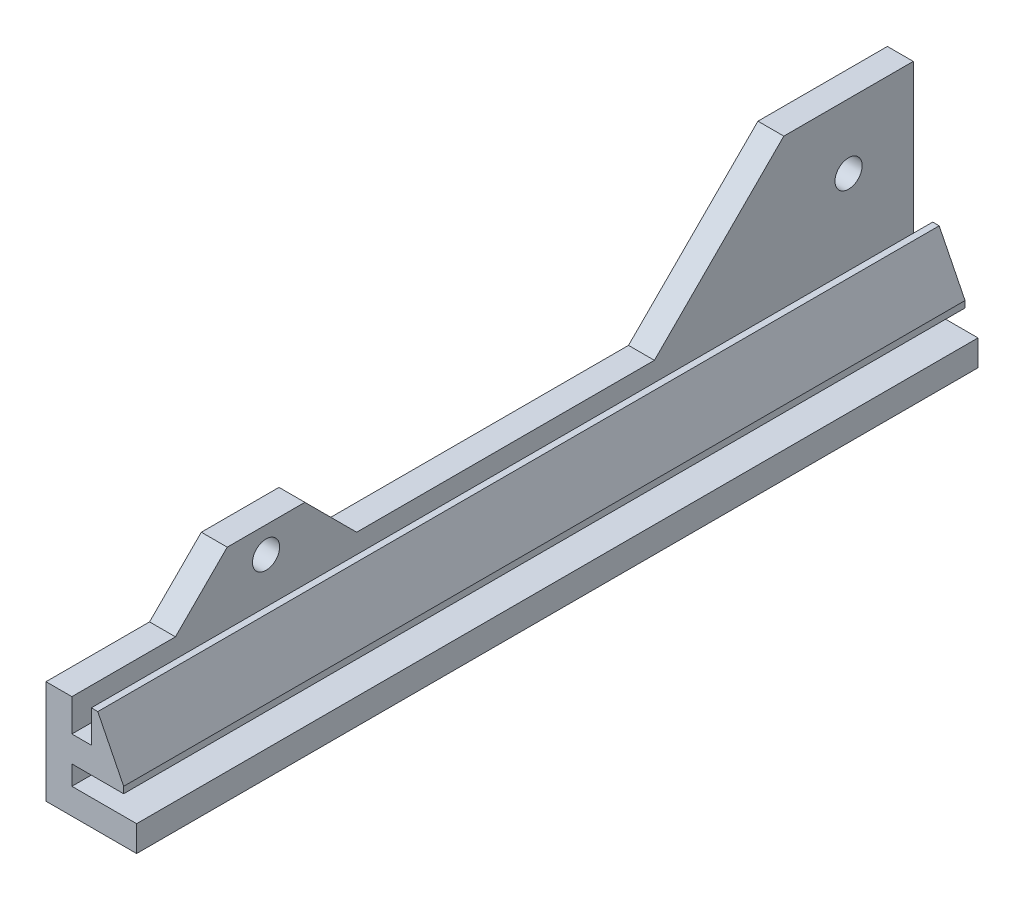
ISO-10303-21;
HEADER;
FILE_DESCRIPTION(('STEP AP214'),'2;1');
FILE_NAME('part.step','',(''),(''),'','','');
FILE_SCHEMA(('AUTOMOTIVE_DESIGN { 1 0 10303 214 1 1 1 1 }'));
ENDSEC;
DATA;
#1=APPLICATION_CONTEXT('core data for automotive mechanical design processes');
#2=APPLICATION_PROTOCOL_DEFINITION('international standard','automotive_design',2000,#1);
#3=PRODUCT_CONTEXT('',#1,'mechanical');
#4=PRODUCT('Part','Part','',(#3));
#5=PRODUCT_RELATED_PRODUCT_CATEGORY('part','',(#4));
#6=PRODUCT_DEFINITION_FORMATION('','',#4);
#7=PRODUCT_DEFINITION_CONTEXT('part definition',#1,'design');
#8=PRODUCT_DEFINITION('design','',#6,#7);
#9=PRODUCT_DEFINITION_SHAPE('','',#8);
#10=(LENGTH_UNIT() NAMED_UNIT(*) SI_UNIT(.MILLI.,.METRE.));
#11=(NAMED_UNIT(*) PLANE_ANGLE_UNIT() SI_UNIT($,.RADIAN.));
#12=(NAMED_UNIT(*) SI_UNIT($,.STERADIAN.) SOLID_ANGLE_UNIT());
#13=UNCERTAINTY_MEASURE_WITH_UNIT(LENGTH_MEASURE(1.E-05),#10,'distance_accuracy_value','');
#14=(GEOMETRIC_REPRESENTATION_CONTEXT(3) GLOBAL_UNCERTAINTY_ASSIGNED_CONTEXT((#13)) GLOBAL_UNIT_ASSIGNED_CONTEXT((#10,
#11,#12)) REPRESENTATION_CONTEXT('',''));
#15=CARTESIAN_POINT('',(0.,0.,0.));
#16=DIRECTION('',(0.,0.,1.));
#17=DIRECTION('',(1.,0.,0.));
#18=AXIS2_PLACEMENT_3D('',#15,#16,#17);
#19=CARTESIAN_POINT('',(0.,16.,130.));
#20=DIRECTION('',(0.,-1.,0.));
#21=DIRECTION('',(0.,0.,-1.));
#22=AXIS2_PLACEMENT_3D('',#19,#20,#21);
#23=PLANE('',#22);
#24=DIRECTION('',(0.,0.,-1.));
#25=VECTOR('',#24,1.);
#26=CARTESIAN_POINT('',(0.,16.,130.));
#27=LINE('',#26,#25);
#28=CARTESIAN_POINT('',(0.,16.,86.0000000000001));
#29=VERTEX_POINT('',#28);
#30=CARTESIAN_POINT('',(0.,16.,40.0000000000005));
#31=VERTEX_POINT('',#30);
#32=EDGE_CURVE('E297',#29,#31,#27,.T.);
#33=ORIENTED_EDGE('',*,*,#32,.F.);
#34=DIRECTION('',(1.,0.,0.));
#35=VECTOR('',#34,1.);
#36=CARTESIAN_POINT('',(0.,16.,86.0000000000001));
#37=LINE('',#36,#35);
#38=CARTESIAN_POINT('',(4.,16.,86.0000000000001));
#39=VERTEX_POINT('',#38);
#40=EDGE_CURVE('E185',#29,#39,#37,.T.);
#41=ORIENTED_EDGE('',*,*,#40,.T.);
#42=DIRECTION('',(0.,0.,-1.));
#43=VECTOR('',#42,1.);
#44=CARTESIAN_POINT('',(4.,16.,130.));
#45=LINE('',#44,#43);
#46=CARTESIAN_POINT('',(4.,16.,40.0000000000005));
#47=VERTEX_POINT('',#46);
#48=EDGE_CURVE('E335',#39,#47,#45,.T.);
#49=ORIENTED_EDGE('',*,*,#48,.T.);
#50=DIRECTION('',(-1.,0.,0.));
#51=VECTOR('',#50,1.);
#52=CARTESIAN_POINT('',(4.,16.,40.0000000000005));
#53=LINE('',#52,#51);
#54=EDGE_CURVE('E238',#47,#31,#53,.T.);
#55=ORIENTED_EDGE('',*,*,#54,.T.);
#56=EDGE_LOOP('',(#33,#41,#49,#55));
#57=FACE_BOUND('',#56,.T.);
#58=ADVANCED_FACE('F47',(#57),#23,.F.);
#59=CARTESIAN_POINT('',(0.,0.,130.));
#60=DIRECTION('',(1.,0.,0.));
#61=DIRECTION('',(0.,0.,-1.));
#62=AXIS2_PLACEMENT_3D('',#59,#60,#61);
#63=PLANE('',#62);
#64=DIRECTION('',(0.,-1.,0.));
#65=VECTOR('',#64,1.);
#66=CARTESIAN_POINT('',(0.,0.,0.));
#67=LINE('',#66,#65);
#68=CARTESIAN_POINT('',(0.,36.,0.));
#69=VERTEX_POINT('',#68);
#70=CARTESIAN_POINT('',(0.,0.,0.));
#71=VERTEX_POINT('',#70);
#72=EDGE_CURVE('E249',#69,#71,#67,.T.);
#73=ORIENTED_EDGE('',*,*,#72,.T.);
#74=DIRECTION('',(0.,0.,-1.));
#75=VECTOR('',#74,1.);
#76=CARTESIAN_POINT('',(0.,0.,130.));
#77=LINE('',#76,#75);
#78=CARTESIAN_POINT('',(0.,0.,130.));
#79=VERTEX_POINT('',#78);
#80=EDGE_CURVE('E379',#79,#71,#77,.T.);
#81=ORIENTED_EDGE('',*,*,#80,.F.);
#82=DIRECTION('',(0.,-1.,0.));
#83=VECTOR('',#82,1.);
#84=CARTESIAN_POINT('',(0.,0.,130.));
#85=LINE('',#84,#83);
#86=CARTESIAN_POINT('',(0.,16.,130.));
#87=VERTEX_POINT('',#86);
#88=EDGE_CURVE('E256',#87,#79,#85,.T.);
#89=ORIENTED_EDGE('',*,*,#88,.F.);
#90=CARTESIAN_POINT('',(0.,16.,114.));
#91=VERTEX_POINT('',#90);
#92=EDGE_CURVE('E332',#87,#91,#27,.T.);
#93=ORIENTED_EDGE('',*,*,#92,.T.);
#94=DIRECTION('',(0.,0.707106781186543,-0.707106781186552));
#95=VECTOR('',#94,1.);
#96=CARTESIAN_POINT('',(0.,1.32476551201444E-13,130.));
#97=LINE('',#96,#95);
#98=CARTESIAN_POINT('',(0.,24.,106.));
#99=VERTEX_POINT('',#98);
#100=EDGE_CURVE('E57',#91,#99,#97,.T.);
#101=ORIENTED_EDGE('',*,*,#100,.T.);
#102=DIRECTION('',(0.,0.,-1.));
#103=VECTOR('',#102,1.);
#104=CARTESIAN_POINT('',(0.,24.,106.));
#105=LINE('',#104,#103);
#106=CARTESIAN_POINT('',(0.,24.,94.));
#107=VERTEX_POINT('',#106);
#108=EDGE_CURVE('E197',#99,#107,#105,.T.);
#109=ORIENTED_EDGE('',*,*,#108,.T.);
#110=DIRECTION('',(0.,-0.707106781186551,-0.707106781186544));
#111=VECTOR('',#110,1.);
#112=CARTESIAN_POINT('',(0.,29.9999999999999,99.9999999999998));
#113=LINE('',#112,#111);
#114=EDGE_CURVE('E180',#107,#29,#113,.T.);
#115=ORIENTED_EDGE('',*,*,#114,.T.);
#116=ORIENTED_EDGE('',*,*,#32,.T.);
#117=DIRECTION('',(0.,0.707106781186539,-0.707106781186556));
#118=VECTOR('',#117,1.);
#119=CARTESIAN_POINT('',(0.,36.,20.));
#120=LINE('',#119,#118);
#121=CARTESIAN_POINT('',(0.,36.,20.));
#122=VERTEX_POINT('',#121);
#123=EDGE_CURVE('E225',#31,#122,#120,.T.);
#124=ORIENTED_EDGE('',*,*,#123,.T.);
#125=DIRECTION('',(0.,0.,-1.));
#126=VECTOR('',#125,1.);
#127=CARTESIAN_POINT('',(0.,36.,0.));
#128=LINE('',#127,#126);
#129=EDGE_CURVE('E234',#122,#69,#128,.T.);
#130=ORIENTED_EDGE('',*,*,#129,.T.);
#131=EDGE_LOOP('',(#73,#81,#89,#93,#101,#109,#115,#116,#124,#130));
#132=FACE_BOUND('',#131,.T.);
#133=CARTESIAN_POINT('',(0.,26.,10.));
#134=DIRECTION('',(-1.,0.,0.));
#135=DIRECTION('',(0.,0.,1.));
#136=AXIS2_PLACEMENT_3D('',#133,#134,#135);
#137=CIRCLE('',#136,2.1);
#138=CARTESIAN_POINT('',(0.,26.,12.1));
#139=VERTEX_POINT('',#138);
#140=EDGE_CURVE('E219',#139,#139,#137,.T.);
#141=ORIENTED_EDGE('',*,*,#140,.F.);
#142=EDGE_LOOP('',(#141));
#143=FACE_BOUND('',#142,.T.);
#144=CARTESIAN_POINT('',(0.,20.,100.));
#145=DIRECTION('',(-1.,0.,0.));
#146=DIRECTION('',(0.,0.,1.));
#147=AXIS2_PLACEMENT_3D('',#144,#145,#146);
#148=CIRCLE('',#147,2.1);
#149=CARTESIAN_POINT('',(0.,20.,102.1));
#150=VERTEX_POINT('',#149);
#151=EDGE_CURVE('E212',#150,#150,#148,.T.);
#152=ORIENTED_EDGE('',*,*,#151,.F.);
#153=EDGE_LOOP('',(#152));
#154=FACE_BOUND('',#153,.T.);
#155=ADVANCED_FACE('F203',(#132,#143,#154),#63,.F.);
#156=CARTESIAN_POINT('',(0.,0.,130.));
#157=DIRECTION('',(0.,1.,0.));
#158=DIRECTION('',(0.,0.,1.));
#159=AXIS2_PLACEMENT_3D('',#156,#157,#158);
#160=PLANE('',#159);
#161=DIRECTION('',(1.,0.,0.));
#162=VECTOR('',#161,1.);
#163=CARTESIAN_POINT('',(0.,0.,0.));
#164=LINE('',#163,#162);
#165=CARTESIAN_POINT('',(14.,0.,0.));
#166=VERTEX_POINT('',#165);
#167=EDGE_CURVE('E300',#71,#166,#164,.T.);
#168=ORIENTED_EDGE('',*,*,#167,.T.);
#169=DIRECTION('',(0.,0.,-1.));
#170=VECTOR('',#169,1.);
#171=CARTESIAN_POINT('',(14.,0.,130.));
#172=LINE('',#171,#170);
#173=CARTESIAN_POINT('',(14.,0.,130.));
#174=VERTEX_POINT('',#173);
#175=EDGE_CURVE('E375',#174,#166,#172,.T.);
#176=ORIENTED_EDGE('',*,*,#175,.F.);
#177=DIRECTION('',(1.,0.,0.));
#178=VECTOR('',#177,1.);
#179=CARTESIAN_POINT('',(0.,0.,130.));
#180=LINE('',#179,#178);
#181=EDGE_CURVE('E260',#79,#174,#180,.T.);
#182=ORIENTED_EDGE('',*,*,#181,.F.);
#183=ORIENTED_EDGE('',*,*,#80,.T.);
#184=EDGE_LOOP('',(#168,#176,#182,#183));
#185=FACE_BOUND('',#184,.T.);
#186=ADVANCED_FACE('F412',(#185),#160,.F.);
#187=CARTESIAN_POINT('',(14.,0.,130.));
#188=DIRECTION('',(-1.,0.,0.));
#189=DIRECTION('',(0.,0.,1.));
#190=AXIS2_PLACEMENT_3D('',#187,#188,#189);
#191=PLANE('',#190);
#192=DIRECTION('',(0.,1.,0.));
#193=VECTOR('',#192,1.);
#194=CARTESIAN_POINT('',(14.,0.,0.));
#195=LINE('',#194,#193);
#196=CARTESIAN_POINT('',(14.,4.,0.));
#197=VERTEX_POINT('',#196);
#198=EDGE_CURVE('E303',#166,#197,#195,.T.);
#199=ORIENTED_EDGE('',*,*,#198,.T.);
#200=DIRECTION('',(0.,0.,-1.));
#201=VECTOR('',#200,1.);
#202=CARTESIAN_POINT('',(14.,4.,130.));
#203=LINE('',#202,#201);
#204=CARTESIAN_POINT('',(14.,4.,130.));
#205=VERTEX_POINT('',#204);
#206=EDGE_CURVE('E371',#205,#197,#203,.T.);
#207=ORIENTED_EDGE('',*,*,#206,.F.);
#208=DIRECTION('',(0.,1.,0.));
#209=VECTOR('',#208,1.);
#210=CARTESIAN_POINT('',(14.,0.,130.));
#211=LINE('',#210,#209);
#212=EDGE_CURVE('E264',#174,#205,#211,.T.);
#213=ORIENTED_EDGE('',*,*,#212,.F.);
#214=ORIENTED_EDGE('',*,*,#175,.T.);
#215=EDGE_LOOP('',(#199,#207,#213,#214));
#216=FACE_BOUND('',#215,.T.);
#217=ADVANCED_FACE('F465',(#216),#191,.F.);
#218=CARTESIAN_POINT('',(14.,4.,130.));
#219=DIRECTION('',(0.,-1.,0.));
#220=DIRECTION('',(1.,0.,0.));
#221=AXIS2_PLACEMENT_3D('',#218,#219,#220);
#222=PLANE('',#221);
#223=DIRECTION('',(-1.,0.,0.));
#224=VECTOR('',#223,1.);
#225=CARTESIAN_POINT('',(14.,4.,0.));
#226=LINE('',#225,#224);
#227=CARTESIAN_POINT('',(4.,4.,0.));
#228=VERTEX_POINT('',#227);
#229=EDGE_CURVE('E306',#197,#228,#226,.T.);
#230=ORIENTED_EDGE('',*,*,#229,.T.);
#231=DIRECTION('',(0.,0.,-1.));
#232=VECTOR('',#231,1.);
#233=CARTESIAN_POINT('',(4.,4.,130.));
#234=LINE('',#233,#232);
#235=CARTESIAN_POINT('',(4.,4.,130.));
#236=VERTEX_POINT('',#235);
#237=EDGE_CURVE('E367',#236,#228,#234,.T.);
#238=ORIENTED_EDGE('',*,*,#237,.F.);
#239=DIRECTION('',(-1.,0.,0.));
#240=VECTOR('',#239,1.);
#241=CARTESIAN_POINT('',(14.,4.,130.));
#242=LINE('',#241,#240);
#243=EDGE_CURVE('E267',#205,#236,#242,.T.);
#244=ORIENTED_EDGE('',*,*,#243,.F.);
#245=ORIENTED_EDGE('',*,*,#206,.T.);
#246=EDGE_LOOP('',(#230,#238,#244,#245));
#247=FACE_BOUND('',#246,.T.);
#248=ADVANCED_FACE('F462',(#247),#222,.F.);
#249=CARTESIAN_POINT('',(4.,4.,130.));
#250=DIRECTION('',(-1.,0.,0.));
#251=DIRECTION('',(0.,0.,1.));
#252=AXIS2_PLACEMENT_3D('',#249,#250,#251);
#253=PLANE('',#252);
#254=DIRECTION('',(0.,1.,0.));
#255=VECTOR('',#254,1.);
#256=CARTESIAN_POINT('',(4.,4.,0.));
#257=LINE('',#256,#255);
#258=CARTESIAN_POINT('',(4.,7.,0.));
#259=VERTEX_POINT('',#258);
#260=EDGE_CURVE('E309',#228,#259,#257,.T.);
#261=ORIENTED_EDGE('',*,*,#260,.T.);
#262=DIRECTION('',(0.,0.,-1.));
#263=VECTOR('',#262,1.);
#264=CARTESIAN_POINT('',(4.,7.,130.));
#265=LINE('',#264,#263);
#266=CARTESIAN_POINT('',(4.,7.,130.));
#267=VERTEX_POINT('',#266);
#268=EDGE_CURVE('E363',#267,#259,#265,.T.);
#269=ORIENTED_EDGE('',*,*,#268,.F.);
#270=DIRECTION('',(0.,1.,0.));
#271=VECTOR('',#270,1.);
#272=CARTESIAN_POINT('',(4.,4.,130.));
#273=LINE('',#272,#271);
#274=EDGE_CURVE('E270',#236,#267,#273,.T.);
#275=ORIENTED_EDGE('',*,*,#274,.F.);
#276=ORIENTED_EDGE('',*,*,#237,.T.);
#277=EDGE_LOOP('',(#261,#269,#275,#276));
#278=FACE_BOUND('',#277,.T.);
#279=ADVANCED_FACE('F457',(#278),#253,.F.);
#280=CARTESIAN_POINT('',(4.,7.,130.));
#281=DIRECTION('',(0.,1.,0.));
#282=DIRECTION('',(0.,0.,1.));
#283=AXIS2_PLACEMENT_3D('',#280,#281,#282);
#284=PLANE('',#283);
#285=DIRECTION('',(1.,0.,0.));
#286=VECTOR('',#285,1.);
#287=CARTESIAN_POINT('',(4.,7.,0.));
#288=LINE('',#287,#286);
#289=CARTESIAN_POINT('',(12.,7.,0.));
#290=VERTEX_POINT('',#289);
#291=EDGE_CURVE('E312',#259,#290,#288,.T.);
#292=ORIENTED_EDGE('',*,*,#291,.T.);
#293=DIRECTION('',(0.,0.,-1.));
#294=VECTOR('',#293,1.);
#295=CARTESIAN_POINT('',(12.,7.,130.));
#296=LINE('',#295,#294);
#297=CARTESIAN_POINT('',(12.,7.,130.));
#298=VERTEX_POINT('',#297);
#299=EDGE_CURVE('E359',#298,#290,#296,.T.);
#300=ORIENTED_EDGE('',*,*,#299,.F.);
#301=DIRECTION('',(1.,0.,0.));
#302=VECTOR('',#301,1.);
#303=CARTESIAN_POINT('',(4.,7.,130.));
#304=LINE('',#303,#302);
#305=EDGE_CURVE('E273',#267,#298,#304,.T.);
#306=ORIENTED_EDGE('',*,*,#305,.F.);
#307=ORIENTED_EDGE('',*,*,#268,.T.);
#308=EDGE_LOOP('',(#292,#300,#306,#307));
#309=FACE_BOUND('',#308,.T.);
#310=ADVANCED_FACE('F453',(#309),#284,.F.);
#311=CARTESIAN_POINT('',(12.,8.,130.));
#312=DIRECTION('',(-1.,0.,0.));
#313=DIRECTION('',(0.,0.,1.));
#314=AXIS2_PLACEMENT_3D('',#311,#312,#313);
#315=PLANE('',#314);
#316=DIRECTION('',(0.,1.,0.));
#317=VECTOR('',#316,1.);
#318=CARTESIAN_POINT('',(12.,8.,0.));
#319=LINE('',#318,#317);
#320=CARTESIAN_POINT('',(12.,8.,0.));
#321=VERTEX_POINT('',#320);
#322=EDGE_CURVE('E315',#290,#321,#319,.T.);
#323=ORIENTED_EDGE('',*,*,#322,.T.);
#324=DIRECTION('',(0.,0.,-1.));
#325=VECTOR('',#324,1.);
#326=CARTESIAN_POINT('',(12.,8.,130.));
#327=LINE('',#326,#325);
#328=CARTESIAN_POINT('',(12.,8.,130.));
#329=VERTEX_POINT('',#328);
#330=EDGE_CURVE('E355',#329,#321,#327,.T.);
#331=ORIENTED_EDGE('',*,*,#330,.F.);
#332=DIRECTION('',(0.,1.,0.));
#333=VECTOR('',#332,1.);
#334=CARTESIAN_POINT('',(12.,8.,130.));
#335=LINE('',#334,#333);
#336=EDGE_CURVE('E276',#298,#329,#335,.T.);
#337=ORIENTED_EDGE('',*,*,#336,.F.);
#338=ORIENTED_EDGE('',*,*,#299,.T.);
#339=EDGE_LOOP('',(#323,#331,#337,#338));
#340=FACE_BOUND('',#339,.T.);
#341=ADVANCED_FACE('F449',(#340),#315,.F.);
#342=CARTESIAN_POINT('',(8.,16.,130.));
#343=DIRECTION('',(-0.894427190999916,-0.447213595499958,0.));
#344=DIRECTION('',(0.447213595499958,-0.894427190999916,0.));
#345=AXIS2_PLACEMENT_3D('',#342,#343,#344);
#346=PLANE('',#345);
#347=DIRECTION('',(-0.447213595499958,0.894427190999916,0.));
#348=VECTOR('',#347,1.);
#349=CARTESIAN_POINT('',(8.,16.,0.));
#350=LINE('',#349,#348);
#351=CARTESIAN_POINT('',(8.,16.,0.));
#352=VERTEX_POINT('',#351);
#353=EDGE_CURVE('E318',#321,#352,#350,.T.);
#354=ORIENTED_EDGE('',*,*,#353,.T.);
#355=DIRECTION('',(0.,0.,-1.));
#356=VECTOR('',#355,1.);
#357=CARTESIAN_POINT('',(8.,16.,130.));
#358=LINE('',#357,#356);
#359=CARTESIAN_POINT('',(8.,16.,130.));
#360=VERTEX_POINT('',#359);
#361=EDGE_CURVE('E351',#360,#352,#358,.T.);
#362=ORIENTED_EDGE('',*,*,#361,.F.);
#363=DIRECTION('',(-0.447213595499958,0.894427190999916,0.));
#364=VECTOR('',#363,1.);
#365=CARTESIAN_POINT('',(8.,16.,130.));
#366=LINE('',#365,#364);
#367=EDGE_CURVE('E279',#329,#360,#366,.T.);
#368=ORIENTED_EDGE('',*,*,#367,.F.);
#369=ORIENTED_EDGE('',*,*,#330,.T.);
#370=EDGE_LOOP('',(#354,#362,#368,#369));
#371=FACE_BOUND('',#370,.T.);
#372=ADVANCED_FACE('F444',(#371),#346,.F.);
#373=CARTESIAN_POINT('',(7.,16.,130.));
#374=DIRECTION('',(0.,-1.,0.));
#375=DIRECTION('',(0.,0.,-1.));
#376=AXIS2_PLACEMENT_3D('',#373,#374,#375);
#377=PLANE('',#376);
#378=DIRECTION('',(-1.,0.,0.));
#379=VECTOR('',#378,1.);
#380=CARTESIAN_POINT('',(7.,16.,0.));
#381=LINE('',#380,#379);
#382=CARTESIAN_POINT('',(7.,16.,0.));
#383=VERTEX_POINT('',#382);
#384=EDGE_CURVE('E321',#352,#383,#381,.T.);
#385=ORIENTED_EDGE('',*,*,#384,.T.);
#386=DIRECTION('',(0.,0.,-1.));
#387=VECTOR('',#386,1.);
#388=CARTESIAN_POINT('',(7.,16.,130.));
#389=LINE('',#388,#387);
#390=CARTESIAN_POINT('',(7.,16.,130.));
#391=VERTEX_POINT('',#390);
#392=EDGE_CURVE('E347',#391,#383,#389,.T.);
#393=ORIENTED_EDGE('',*,*,#392,.F.);
#394=DIRECTION('',(-1.,0.,0.));
#395=VECTOR('',#394,1.);
#396=CARTESIAN_POINT('',(7.,16.,130.));
#397=LINE('',#396,#395);
#398=EDGE_CURVE('E282',#360,#391,#397,.T.);
#399=ORIENTED_EDGE('',*,*,#398,.F.);
#400=ORIENTED_EDGE('',*,*,#361,.T.);
#401=EDGE_LOOP('',(#385,#393,#399,#400));
#402=FACE_BOUND('',#401,.T.);
#403=ADVANCED_FACE('F438',(#402),#377,.F.);
#404=CARTESIAN_POINT('',(7.,11.,130.));
#405=DIRECTION('',(1.,0.,0.));
#406=DIRECTION('',(0.,0.,-1.));
#407=AXIS2_PLACEMENT_3D('',#404,#405,#406);
#408=PLANE('',#407);
#409=DIRECTION('',(0.,-1.,0.));
#410=VECTOR('',#409,1.);
#411=CARTESIAN_POINT('',(7.,11.,0.));
#412=LINE('',#411,#410);
#413=CARTESIAN_POINT('',(7.,11.,0.));
#414=VERTEX_POINT('',#413);
#415=EDGE_CURVE('E324',#383,#414,#412,.T.);
#416=ORIENTED_EDGE('',*,*,#415,.T.);
#417=DIRECTION('',(0.,0.,-1.));
#418=VECTOR('',#417,1.);
#419=CARTESIAN_POINT('',(7.,11.,130.));
#420=LINE('',#419,#418);
#421=CARTESIAN_POINT('',(7.,11.,130.));
#422=VERTEX_POINT('',#421);
#423=EDGE_CURVE('E343',#422,#414,#420,.T.);
#424=ORIENTED_EDGE('',*,*,#423,.F.);
#425=DIRECTION('',(0.,-1.,0.));
#426=VECTOR('',#425,1.);
#427=CARTESIAN_POINT('',(7.,11.,130.));
#428=LINE('',#427,#426);
#429=EDGE_CURVE('E285',#391,#422,#428,.T.);
#430=ORIENTED_EDGE('',*,*,#429,.F.);
#431=ORIENTED_EDGE('',*,*,#392,.T.);
#432=EDGE_LOOP('',(#416,#424,#430,#431));
#433=FACE_BOUND('',#432,.T.);
#434=ADVANCED_FACE('F434',(#433),#408,.F.);
#435=CARTESIAN_POINT('',(4.,11.,130.));
#436=DIRECTION('',(0.,-1.,0.));
#437=DIRECTION('',(0.,0.,-1.));
#438=AXIS2_PLACEMENT_3D('',#435,#436,#437);
#439=PLANE('',#438);
#440=DIRECTION('',(-1.,0.,0.));
#441=VECTOR('',#440,1.);
#442=CARTESIAN_POINT('',(4.,11.,0.));
#443=LINE('',#442,#441);
#444=CARTESIAN_POINT('',(4.,11.,0.));
#445=VERTEX_POINT('',#444);
#446=EDGE_CURVE('E327',#414,#445,#443,.T.);
#447=ORIENTED_EDGE('',*,*,#446,.T.);
#448=DIRECTION('',(0.,0.,-1.));
#449=VECTOR('',#448,1.);
#450=CARTESIAN_POINT('',(4.,11.,130.));
#451=LINE('',#450,#449);
#452=CARTESIAN_POINT('',(4.,11.,130.));
#453=VERTEX_POINT('',#452);
#454=EDGE_CURVE('E339',#453,#445,#451,.T.);
#455=ORIENTED_EDGE('',*,*,#454,.F.);
#456=DIRECTION('',(-1.,0.,0.));
#457=VECTOR('',#456,1.);
#458=CARTESIAN_POINT('',(4.,11.,130.));
#459=LINE('',#458,#457);
#460=EDGE_CURVE('E288',#422,#453,#459,.T.);
#461=ORIENTED_EDGE('',*,*,#460,.F.);
#462=ORIENTED_EDGE('',*,*,#423,.T.);
#463=EDGE_LOOP('',(#447,#455,#461,#462));
#464=FACE_BOUND('',#463,.T.);
#465=ADVANCED_FACE('F429',(#464),#439,.F.);
#466=CARTESIAN_POINT('',(4.,16.,130.));
#467=DIRECTION('',(-1.,0.,0.));
#468=DIRECTION('',(0.,-1.,0.));
#469=AXIS2_PLACEMENT_3D('',#466,#467,#468);
#470=PLANE('',#469);
#471=DIRECTION('',(0.,1.,0.));
#472=VECTOR('',#471,1.);
#473=CARTESIAN_POINT('',(4.,16.,0.));
#474=LINE('',#473,#472);
#475=CARTESIAN_POINT('',(4.,36.,0.));
#476=VERTEX_POINT('',#475);
#477=EDGE_CURVE('E261',#445,#476,#474,.T.);
#478=ORIENTED_EDGE('',*,*,#477,.T.);
#479=DIRECTION('',(0.,0.,-1.));
#480=VECTOR('',#479,1.);
#481=CARTESIAN_POINT('',(4.,36.,0.));
#482=LINE('',#481,#480);
#483=CARTESIAN_POINT('',(4.,36.,20.));
#484=VERTEX_POINT('',#483);
#485=EDGE_CURVE('E233',#484,#476,#482,.T.);
#486=ORIENTED_EDGE('',*,*,#485,.F.);
#487=DIRECTION('',(0.,0.707106781186539,-0.707106781186556));
#488=VECTOR('',#487,1.);
#489=CARTESIAN_POINT('',(4.,36.,20.));
#490=LINE('',#489,#488);
#491=EDGE_CURVE('E229',#47,#484,#490,.T.);
#492=ORIENTED_EDGE('',*,*,#491,.F.);
#493=ORIENTED_EDGE('',*,*,#48,.F.);
#494=DIRECTION('',(0.,0.707106781186551,0.707106781186544));
#495=VECTOR('',#494,1.);
#496=CARTESIAN_POINT('',(4.,38.,108.));
#497=LINE('',#496,#495);
#498=CARTESIAN_POINT('',(4.,24.,94.));
#499=VERTEX_POINT('',#498);
#500=EDGE_CURVE('E190',#39,#499,#497,.T.);
#501=ORIENTED_EDGE('',*,*,#500,.T.);
#502=DIRECTION('',(0.,0.,-1.));
#503=VECTOR('',#502,1.);
#504=CARTESIAN_POINT('',(4.,24.,106.));
#505=LINE('',#504,#503);
#506=CARTESIAN_POINT('',(4.,24.,106.));
#507=VERTEX_POINT('',#506);
#508=EDGE_CURVE('E198',#507,#499,#505,.T.);
#509=ORIENTED_EDGE('',*,*,#508,.F.);
#510=DIRECTION('',(0.,-0.707106781186543,0.707106781186552));
#511=VECTOR('',#510,1.);
#512=CARTESIAN_POINT('',(4.,8.00000000000004,122.));
#513=LINE('',#512,#511);
#514=CARTESIAN_POINT('',(4.,16.,114.));
#515=VERTEX_POINT('',#514);
#516=EDGE_CURVE('E11',#507,#515,#513,.T.);
#517=ORIENTED_EDGE('',*,*,#516,.T.);
#518=CARTESIAN_POINT('',(4.,16.,130.));
#519=VERTEX_POINT('',#518);
#520=EDGE_CURVE('E336',#519,#515,#45,.T.);
#521=ORIENTED_EDGE('',*,*,#520,.F.);
#522=DIRECTION('',(0.,1.,0.));
#523=VECTOR('',#522,1.);
#524=CARTESIAN_POINT('',(4.,16.,130.));
#525=LINE('',#524,#523);
#526=EDGE_CURVE('E291',#453,#519,#525,.T.);
#527=ORIENTED_EDGE('',*,*,#526,.F.);
#528=ORIENTED_EDGE('',*,*,#454,.T.);
#529=EDGE_LOOP('',(#478,#486,#492,#493,#501,#509,#517,#521,#527,#528));
#530=FACE_BOUND('',#529,.T.);
#531=CARTESIAN_POINT('',(4.,26.,10.));
#532=DIRECTION('',(-1.,0.,0.));
#533=DIRECTION('',(0.,0.,1.));
#534=AXIS2_PLACEMENT_3D('',#531,#532,#533);
#535=CIRCLE('',#534,2.1);
#536=CARTESIAN_POINT('',(4.,26.,12.1));
#537=VERTEX_POINT('',#536);
#538=EDGE_CURVE('E221',#537,#537,#535,.T.);
#539=ORIENTED_EDGE('',*,*,#538,.T.);
#540=EDGE_LOOP('',(#539));
#541=FACE_BOUND('',#540,.T.);
#542=CARTESIAN_POINT('',(4.,20.,100.));
#543=DIRECTION('',(-1.,0.,0.));
#544=DIRECTION('',(0.,0.,1.));
#545=AXIS2_PLACEMENT_3D('',#542,#543,#544);
#546=CIRCLE('',#545,2.1);
#547=CARTESIAN_POINT('',(4.,20.,102.1));
#548=VERTEX_POINT('',#547);
#549=EDGE_CURVE('E207',#548,#548,#546,.T.);
#550=ORIENTED_EDGE('',*,*,#549,.T.);
#551=EDGE_LOOP('',(#550));
#552=FACE_BOUND('',#551,.T.);
#553=ADVANCED_FACE('F421',(#530,#541,#552),#470,.F.);
#554=ORIENTED_EDGE('',*,*,#520,.T.);
#555=DIRECTION('',(-1.,0.,0.));
#556=VECTOR('',#555,1.);
#557=CARTESIAN_POINT('',(0.,16.,114.));
#558=LINE('',#557,#556);
#559=EDGE_CURVE('E191',#515,#91,#558,.T.);
#560=ORIENTED_EDGE('',*,*,#559,.T.);
#561=ORIENTED_EDGE('',*,*,#92,.F.);
#562=DIRECTION('',(-1.,0.,0.));
#563=VECTOR('',#562,1.);
#564=CARTESIAN_POINT('',(0.,16.,130.));
#565=LINE('',#564,#563);
#566=EDGE_CURVE('E294',#519,#87,#565,.T.);
#567=ORIENTED_EDGE('',*,*,#566,.F.);
#568=EDGE_LOOP('',(#554,#560,#561,#567));
#569=FACE_BOUND('',#568,.T.);
#570=ADVANCED_FACE('F419',(#569),#23,.F.);
#571=CARTESIAN_POINT('',(0.,0.,130.));
#572=DIRECTION('',(0.,0.,-1.));
#573=DIRECTION('',(-1.,0.,0.));
#574=AXIS2_PLACEMENT_3D('',#571,#572,#573);
#575=PLANE('',#574);
#576=ORIENTED_EDGE('',*,*,#88,.T.);
#577=ORIENTED_EDGE('',*,*,#181,.T.);
#578=ORIENTED_EDGE('',*,*,#212,.T.);
#579=ORIENTED_EDGE('',*,*,#243,.T.);
#580=ORIENTED_EDGE('',*,*,#274,.T.);
#581=ORIENTED_EDGE('',*,*,#305,.T.);
#582=ORIENTED_EDGE('',*,*,#336,.T.);
#583=ORIENTED_EDGE('',*,*,#367,.T.);
#584=ORIENTED_EDGE('',*,*,#398,.T.);
#585=ORIENTED_EDGE('',*,*,#429,.T.);
#586=ORIENTED_EDGE('',*,*,#460,.T.);
#587=ORIENTED_EDGE('',*,*,#526,.T.);
#588=ORIENTED_EDGE('',*,*,#566,.T.);
#589=EDGE_LOOP('',(#576,#577,#578,#579,#580,#581,#582,#583,#584,#585,#586,#587,#588));
#590=FACE_BOUND('',#589,.T.);
#591=ADVANCED_FACE('F415',(#590),#575,.F.);
#592=CARTESIAN_POINT('',(0.,0.,0.));
#593=DIRECTION('',(0.,0.,-1.));
#594=DIRECTION('',(-1.,0.,0.));
#595=AXIS2_PLACEMENT_3D('',#592,#593,#594);
#596=PLANE('',#595);
#597=ORIENTED_EDGE('',*,*,#72,.F.);
#598=DIRECTION('',(-1.,0.,0.));
#599=VECTOR('',#598,1.);
#600=CARTESIAN_POINT('',(4.,36.,0.));
#601=LINE('',#600,#599);
#602=EDGE_CURVE('E245',#476,#69,#601,.T.);
#603=ORIENTED_EDGE('',*,*,#602,.F.);
#604=ORIENTED_EDGE('',*,*,#477,.F.);
#605=ORIENTED_EDGE('',*,*,#446,.F.);
#606=ORIENTED_EDGE('',*,*,#415,.F.);
#607=ORIENTED_EDGE('',*,*,#384,.F.);
#608=ORIENTED_EDGE('',*,*,#353,.F.);
#609=ORIENTED_EDGE('',*,*,#322,.F.);
#610=ORIENTED_EDGE('',*,*,#291,.F.);
#611=ORIENTED_EDGE('',*,*,#260,.F.);
#612=ORIENTED_EDGE('',*,*,#229,.F.);
#613=ORIENTED_EDGE('',*,*,#198,.F.);
#614=ORIENTED_EDGE('',*,*,#167,.F.);
#615=EDGE_LOOP('',(#597,#603,#604,#605,#606,#607,#608,#609,#610,#611,#612,#613,#614));
#616=FACE_BOUND('',#615,.T.);
#617=ADVANCED_FACE('F406',(#616),#596,.T.);
#618=CARTESIAN_POINT('',(4.,36.,0.));
#619=DIRECTION('',(0.,1.,0.));
#620=DIRECTION('',(0.,0.,1.));
#621=AXIS2_PLACEMENT_3D('',#618,#619,#620);
#622=PLANE('',#621);
#623=ORIENTED_EDGE('',*,*,#129,.F.);
#624=DIRECTION('',(-1.,0.,0.));
#625=VECTOR('',#624,1.);
#626=CARTESIAN_POINT('',(4.,36.,20.));
#627=LINE('',#626,#625);
#628=EDGE_CURVE('E250',#484,#122,#627,.T.);
#629=ORIENTED_EDGE('',*,*,#628,.F.);
#630=ORIENTED_EDGE('',*,*,#485,.T.);
#631=ORIENTED_EDGE('',*,*,#602,.T.);
#632=EDGE_LOOP('',(#623,#629,#630,#631));
#633=FACE_BOUND('',#632,.T.);
#634=ADVANCED_FACE('F401',(#633),#622,.T.);
#635=CARTESIAN_POINT('',(4.,36.,20.));
#636=DIRECTION('',(0.,0.707106781186556,0.707106781186539));
#637=DIRECTION('',(0.,-0.707106781186539,0.707106781186556));
#638=AXIS2_PLACEMENT_3D('',#635,#636,#637);
#639=PLANE('',#638);
#640=ORIENTED_EDGE('',*,*,#123,.F.);
#641=ORIENTED_EDGE('',*,*,#54,.F.);
#642=ORIENTED_EDGE('',*,*,#491,.T.);
#643=ORIENTED_EDGE('',*,*,#628,.T.);
#644=EDGE_LOOP('',(#640,#641,#642,#643));
#645=FACE_BOUND('',#644,.T.);
#646=ADVANCED_FACE('F398',(#645),#639,.T.);
#647=CARTESIAN_POINT('',(4.,26.,10.));
#648=DIRECTION('',(-1.,0.,0.));
#649=DIRECTION('',(0.,0.,1.));
#650=AXIS2_PLACEMENT_3D('',#647,#648,#649);
#651=CYLINDRICAL_SURFACE('',#650,2.1);
#652=ORIENTED_EDGE('',*,*,#538,.F.);
#653=EDGE_LOOP('',(#652));
#654=FACE_BOUND('',#653,.T.);
#655=ORIENTED_EDGE('',*,*,#140,.T.);
#656=EDGE_LOOP('',(#655));
#657=FACE_BOUND('',#656,.T.);
#658=ADVANCED_FACE('F566',(#654,#657),#651,.F.);
#659=CARTESIAN_POINT('',(4.,24.,106.));
#660=DIRECTION('',(0.,1.,0.));
#661=DIRECTION('',(0.,0.,1.));
#662=AXIS2_PLACEMENT_3D('',#659,#660,#661);
#663=PLANE('',#662);
#664=ORIENTED_EDGE('',*,*,#108,.F.);
#665=DIRECTION('',(-1.,0.,0.));
#666=VECTOR('',#665,1.);
#667=CARTESIAN_POINT('',(4.,24.,106.));
#668=LINE('',#667,#666);
#669=EDGE_CURVE('E200',#507,#99,#668,.T.);
#670=ORIENTED_EDGE('',*,*,#669,.F.);
#671=ORIENTED_EDGE('',*,*,#508,.T.);
#672=DIRECTION('',(-1.,0.,0.));
#673=VECTOR('',#672,1.);
#674=CARTESIAN_POINT('',(4.,24.,94.));
#675=LINE('',#674,#673);
#676=EDGE_CURVE('E184',#499,#107,#675,.T.);
#677=ORIENTED_EDGE('',*,*,#676,.T.);
#678=EDGE_LOOP('',(#664,#670,#671,#677));
#679=FACE_BOUND('',#678,.T.);
#680=ADVANCED_FACE('F196',(#679),#663,.T.);
#681=CARTESIAN_POINT('',(4.,20.,100.));
#682=DIRECTION('',(-1.,0.,0.));
#683=DIRECTION('',(0.,0.,1.));
#684=AXIS2_PLACEMENT_3D('',#681,#682,#683);
#685=CYLINDRICAL_SURFACE('',#684,2.1);
#686=ORIENTED_EDGE('',*,*,#549,.F.);
#687=EDGE_LOOP('',(#686));
#688=FACE_BOUND('',#687,.T.);
#689=ORIENTED_EDGE('',*,*,#151,.T.);
#690=EDGE_LOOP('',(#689));
#691=FACE_BOUND('',#690,.T.);
#692=ADVANCED_FACE('F579',(#688,#691),#685,.F.);
#693=CARTESIAN_POINT('',(4.,24.,94.));
#694=DIRECTION('',(0.,-0.707106781186544,0.707106781186551));
#695=DIRECTION('',(-1.,0.,0.));
#696=AXIS2_PLACEMENT_3D('',#693,#694,#695);
#697=PLANE('',#696);
#698=ORIENTED_EDGE('',*,*,#500,.F.);
#699=ORIENTED_EDGE('',*,*,#40,.F.);
#700=ORIENTED_EDGE('',*,*,#114,.F.);
#701=ORIENTED_EDGE('',*,*,#676,.F.);
#702=EDGE_LOOP('',(#698,#699,#700,#701));
#703=FACE_BOUND('',#702,.T.);
#704=ADVANCED_FACE('F183',(#703),#697,.F.);
#705=CARTESIAN_POINT('',(0.,16.,114.));
#706=DIRECTION('',(0.,-0.707106781186552,-0.707106781186543));
#707=DIRECTION('',(-1.,0.,0.));
#708=AXIS2_PLACEMENT_3D('',#705,#706,#707);
#709=PLANE('',#708);
#710=ORIENTED_EDGE('',*,*,#516,.F.);
#711=ORIENTED_EDGE('',*,*,#669,.T.);
#712=ORIENTED_EDGE('',*,*,#100,.F.);
#713=ORIENTED_EDGE('',*,*,#559,.F.);
#714=EDGE_LOOP('',(#710,#711,#712,#713));
#715=FACE_BOUND('',#714,.T.);
#716=ADVANCED_FACE('F50',(#715),#709,.F.);
#717=CLOSED_SHELL('',(#58,#155,#186,#217,#248,#279,#310,#341,#372,#403,#434,#465,#553,#570,#591,
#617,#634,#646,#658,#680,#692,#704,#716));
#718=MANIFOLD_SOLID_BREP('B2',#717);
#719=ADVANCED_BREP_SHAPE_REPRESENTATION('',(#18,#718),#14);
#720=SHAPE_DEFINITION_REPRESENTATION(#9,#719);
ENDSEC;
END-ISO-10303-21;
